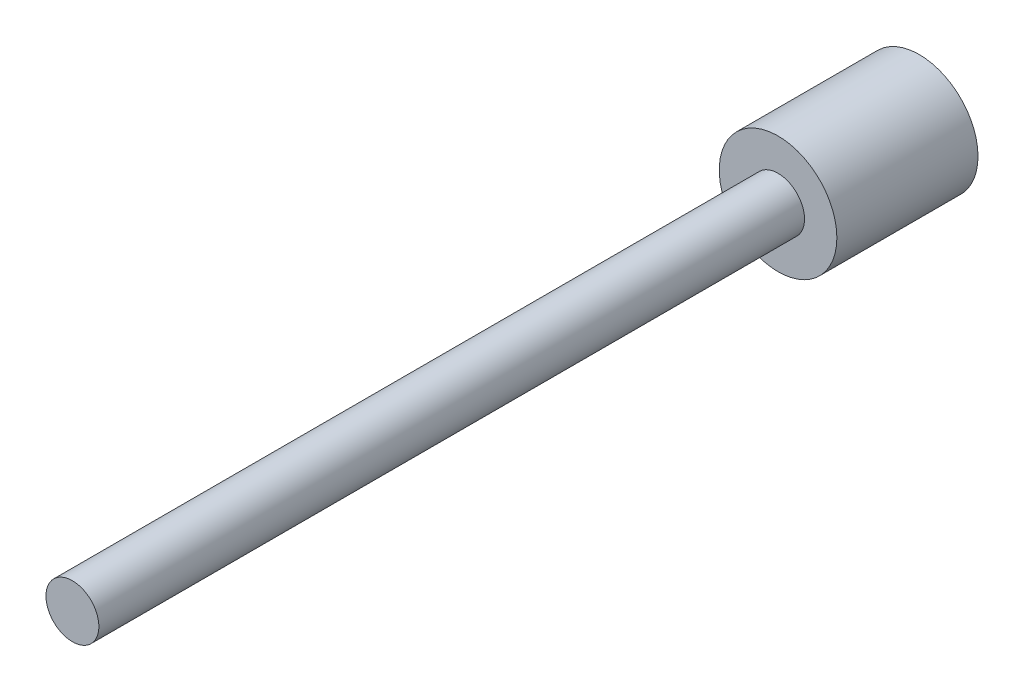
ISO-10303-21;
HEADER;
FILE_DESCRIPTION(('STEP AP214'),'2;1');
FILE_NAME('part.step','',(''),(''),'','','');
FILE_SCHEMA(('AUTOMOTIVE_DESIGN { 1 0 10303 214 1 1 1 1 }'));
ENDSEC;
DATA;
#1=APPLICATION_CONTEXT('core data for automotive mechanical design processes');
#2=APPLICATION_PROTOCOL_DEFINITION('international standard','automotive_design',2000,#1);
#3=PRODUCT_CONTEXT('',#1,'mechanical');
#4=PRODUCT('Part','Part','',(#3));
#5=PRODUCT_RELATED_PRODUCT_CATEGORY('part','',(#4));
#6=PRODUCT_DEFINITION_FORMATION('','',#4);
#7=PRODUCT_DEFINITION_CONTEXT('part definition',#1,'design');
#8=PRODUCT_DEFINITION('design','',#6,#7);
#9=PRODUCT_DEFINITION_SHAPE('','',#8);
#10=(LENGTH_UNIT() NAMED_UNIT(*) SI_UNIT(.MILLI.,.METRE.));
#11=(NAMED_UNIT(*) PLANE_ANGLE_UNIT() SI_UNIT($,.RADIAN.));
#12=(NAMED_UNIT(*) SI_UNIT($,.STERADIAN.) SOLID_ANGLE_UNIT());
#13=UNCERTAINTY_MEASURE_WITH_UNIT(LENGTH_MEASURE(1.E-05),#10,'distance_accuracy_value','');
#14=(GEOMETRIC_REPRESENTATION_CONTEXT(3) GLOBAL_UNCERTAINTY_ASSIGNED_CONTEXT((#13)) GLOBAL_UNIT_ASSIGNED_CONTEXT((#10,
#11,#12)) REPRESENTATION_CONTEXT('',''));
#15=CARTESIAN_POINT('',(0.,0.,0.));
#16=DIRECTION('',(0.,0.,1.));
#17=DIRECTION('',(1.,0.,0.));
#18=AXIS2_PLACEMENT_3D('',#15,#16,#17);
#19=CARTESIAN_POINT('',(0.,0.,12.));
#20=DIRECTION('',(0.,0.,1.));
#21=DIRECTION('',(1.,0.,0.));
#22=AXIS2_PLACEMENT_3D('',#19,#20,#21);
#23=PLANE('',#22);
#24=CARTESIAN_POINT('',(0.,0.,12.));
#25=DIRECTION('',(0.,0.,1.));
#26=DIRECTION('',(1.,0.,0.));
#27=AXIS2_PLACEMENT_3D('',#24,#25,#26);
#28=CIRCLE('',#27,5.);
#29=CARTESIAN_POINT('',(5.,0.,12.));
#30=VERTEX_POINT('',#29);
#31=EDGE_CURVE('E46',#30,#30,#28,.T.);
#32=ORIENTED_EDGE('',*,*,#31,.T.);
#33=EDGE_LOOP('',(#32));
#34=FACE_BOUND('',#33,.T.);
#35=CARTESIAN_POINT('',(0.,0.,12.));
#36=DIRECTION('',(0.,0.,1.));
#37=DIRECTION('',(1.,0.,0.));
#38=AXIS2_PLACEMENT_3D('',#35,#36,#37);
#39=CIRCLE('',#38,2.25);
#40=CARTESIAN_POINT('',(2.25,0.,12.));
#41=VERTEX_POINT('',#40);
#42=EDGE_CURVE('E52',#41,#41,#39,.T.);
#43=ORIENTED_EDGE('',*,*,#42,.F.);
#44=EDGE_LOOP('',(#43));
#45=FACE_BOUND('',#44,.T.);
#46=ADVANCED_FACE('F31',(#34,#45),#23,.T.);
#47=CARTESIAN_POINT('',(0.,0.,0.));
#48=DIRECTION('',(0.,0.,1.));
#49=DIRECTION('',(1.,0.,0.));
#50=AXIS2_PLACEMENT_3D('',#47,#48,#49);
#51=PLANE('',#50);
#52=CARTESIAN_POINT('',(0.,0.,0.));
#53=DIRECTION('',(0.,0.,1.));
#54=DIRECTION('',(1.,0.,0.));
#55=AXIS2_PLACEMENT_3D('',#52,#53,#54);
#56=CIRCLE('',#55,5.);
#57=CARTESIAN_POINT('',(5.,0.,0.));
#58=VERTEX_POINT('',#57);
#59=EDGE_CURVE('E10',#58,#58,#56,.T.);
#60=ORIENTED_EDGE('',*,*,#59,.F.);
#61=EDGE_LOOP('',(#60));
#62=FACE_BOUND('',#61,.T.);
#63=CARTESIAN_POINT('',(0.,0.,0.));
#64=DIRECTION('',(0.,0.,1.));
#65=DIRECTION('',(1.,0.,0.));
#66=AXIS2_PLACEMENT_3D('',#63,#64,#65);
#67=CIRCLE('',#66,1.5);
#68=CARTESIAN_POINT('',(1.5,0.,0.));
#69=VERTEX_POINT('',#68);
#70=EDGE_CURVE('E38',#69,#69,#67,.T.);
#71=ORIENTED_EDGE('',*,*,#70,.T.);
#72=EDGE_LOOP('',(#71));
#73=FACE_BOUND('',#72,.T.);
#74=ADVANCED_FACE('F68',(#62,#73),#51,.F.);
#75=CARTESIAN_POINT('',(0.,0.,10.));
#76=DIRECTION('',(0.,0.,-1.));
#77=DIRECTION('',(-1.,0.,0.));
#78=AXIS2_PLACEMENT_3D('',#75,#76,#77);
#79=CYLINDRICAL_SURFACE('',#78,5.);
#80=ORIENTED_EDGE('',*,*,#59,.T.);
#81=EDGE_LOOP('',(#80));
#82=FACE_BOUND('',#81,.T.);
#83=ORIENTED_EDGE('',*,*,#31,.F.);
#84=EDGE_LOOP('',(#83));
#85=FACE_BOUND('',#84,.T.);
#86=ADVANCED_FACE('F33',(#82,#85),#79,.T.);
#87=CARTESIAN_POINT('',(0.,0.,10.));
#88=DIRECTION('',(0.,0.,-1.));
#89=DIRECTION('',(-1.,0.,0.));
#90=AXIS2_PLACEMENT_3D('',#87,#88,#89);
#91=CYLINDRICAL_SURFACE('',#90,1.5);
#92=CARTESIAN_POINT('',(0.,0.,10.));
#93=DIRECTION('',(0.,0.,1.));
#94=DIRECTION('',(1.,0.,0.));
#95=AXIS2_PLACEMENT_3D('',#92,#93,#94);
#96=CIRCLE('',#95,1.5);
#97=CARTESIAN_POINT('',(1.5,0.,10.));
#98=VERTEX_POINT('',#97);
#99=EDGE_CURVE('E42',#98,#98,#96,.T.);
#100=ORIENTED_EDGE('',*,*,#99,.T.);
#101=EDGE_LOOP('',(#100));
#102=FACE_BOUND('',#101,.T.);
#103=ORIENTED_EDGE('',*,*,#70,.F.);
#104=EDGE_LOOP('',(#103));
#105=FACE_BOUND('',#104,.T.);
#106=ADVANCED_FACE('F79',(#102,#105),#91,.F.);
#107=CARTESIAN_POINT('',(0.,0.,10.));
#108=DIRECTION('',(0.,0.,1.));
#109=DIRECTION('',(1.,0.,0.));
#110=AXIS2_PLACEMENT_3D('',#107,#108,#109);
#111=PLANE('',#110);
#112=ORIENTED_EDGE('',*,*,#99,.F.);
#113=EDGE_LOOP('',(#112));
#114=FACE_BOUND('',#113,.T.);
#115=ADVANCED_FACE('F63',(#114),#111,.F.);
#116=CARTESIAN_POINT('',(0.,0.,72.));
#117=DIRECTION('',(0.,0.,-1.));
#118=DIRECTION('',(-1.,0.,0.));
#119=AXIS2_PLACEMENT_3D('',#116,#117,#118);
#120=CYLINDRICAL_SURFACE('',#119,2.25);
#121=CARTESIAN_POINT('',(0.,0.,72.));
#122=DIRECTION('',(0.,0.,1.));
#123=DIRECTION('',(1.,0.,0.));
#124=AXIS2_PLACEMENT_3D('',#121,#122,#123);
#125=CIRCLE('',#124,2.25);
#126=CARTESIAN_POINT('',(2.25,0.,72.));
#127=VERTEX_POINT('',#126);
#128=EDGE_CURVE('E51',#127,#127,#125,.T.);
#129=ORIENTED_EDGE('',*,*,#128,.F.);
#130=EDGE_LOOP('',(#129));
#131=FACE_BOUND('',#130,.T.);
#132=ORIENTED_EDGE('',*,*,#42,.T.);
#133=EDGE_LOOP('',(#132));
#134=FACE_BOUND('',#133,.T.);
#135=ADVANCED_FACE('F60',(#131,#134),#120,.T.);
#136=CARTESIAN_POINT('',(0.,0.,72.));
#137=DIRECTION('',(0.,0.,1.));
#138=DIRECTION('',(1.,0.,0.));
#139=AXIS2_PLACEMENT_3D('',#136,#137,#138);
#140=PLANE('',#139);
#141=ORIENTED_EDGE('',*,*,#128,.T.);
#142=EDGE_LOOP('',(#141));
#143=FACE_BOUND('',#142,.T.);
#144=ADVANCED_FACE('F58',(#143),#140,.T.);
#145=CLOSED_SHELL('',(#46,#74,#86,#106,#115,#135,#144));
#146=MANIFOLD_SOLID_BREP('B2',#145);
#147=ADVANCED_BREP_SHAPE_REPRESENTATION('',(#18,#146),#14);
#148=SHAPE_DEFINITION_REPRESENTATION(#9,#147);
ENDSEC;
END-ISO-10303-21;
